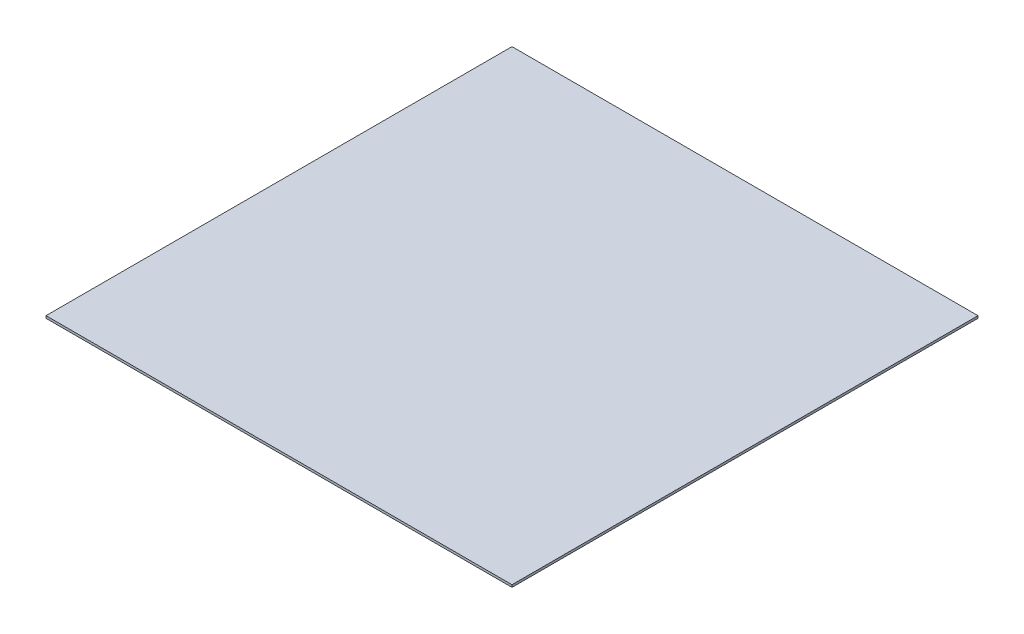
ISO-10303-21;
HEADER;
FILE_DESCRIPTION(('STEP AP214'),'2;1');
FILE_NAME('part.step','',(''),(''),'','','');
FILE_SCHEMA(('AUTOMOTIVE_DESIGN { 1 0 10303 214 1 1 1 1 }'));
ENDSEC;
DATA;
#1=APPLICATION_CONTEXT('core data for automotive mechanical design processes');
#2=APPLICATION_PROTOCOL_DEFINITION('international standard','automotive_design',2000,#1);
#3=PRODUCT_CONTEXT('',#1,'mechanical');
#4=PRODUCT('Part','Part','',(#3));
#5=PRODUCT_RELATED_PRODUCT_CATEGORY('part','',(#4));
#6=PRODUCT_DEFINITION_FORMATION('','',#4);
#7=PRODUCT_DEFINITION_CONTEXT('part definition',#1,'design');
#8=PRODUCT_DEFINITION('design','',#6,#7);
#9=PRODUCT_DEFINITION_SHAPE('','',#8);
#10=(LENGTH_UNIT() NAMED_UNIT(*) SI_UNIT(.MILLI.,.METRE.));
#11=(NAMED_UNIT(*) PLANE_ANGLE_UNIT() SI_UNIT($,.RADIAN.));
#12=(NAMED_UNIT(*) SI_UNIT($,.STERADIAN.) SOLID_ANGLE_UNIT());
#13=UNCERTAINTY_MEASURE_WITH_UNIT(LENGTH_MEASURE(1.E-05),#10,'distance_accuracy_value','');
#14=(GEOMETRIC_REPRESENTATION_CONTEXT(3) GLOBAL_UNCERTAINTY_ASSIGNED_CONTEXT((#13)) GLOBAL_UNIT_ASSIGNED_CONTEXT((#10,
#11,#12)) REPRESENTATION_CONTEXT('',''));
#15=CARTESIAN_POINT('',(0.,0.,0.));
#16=DIRECTION('',(0.,0.,1.));
#17=DIRECTION('',(1.,0.,0.));
#18=AXIS2_PLACEMENT_3D('',#15,#16,#17);
#19=CARTESIAN_POINT('',(200.,1.,200.));
#20=DIRECTION('',(-1.,0.,0.));
#21=DIRECTION('',(0.,0.,1.));
#22=AXIS2_PLACEMENT_3D('',#19,#20,#21);
#23=PLANE('',#22);
#24=DIRECTION('',(0.,0.,-1.));
#25=VECTOR('',#24,1.);
#26=CARTESIAN_POINT('',(200.,-1.,200.));
#27=LINE('',#26,#25);
#28=CARTESIAN_POINT('',(200.,-1.,200.));
#29=VERTEX_POINT('',#28);
#30=CARTESIAN_POINT('',(200.,-1.,-200.));
#31=VERTEX_POINT('',#30);
#32=EDGE_CURVE('E101',#29,#31,#27,.T.);
#33=ORIENTED_EDGE('',*,*,#32,.T.);
#34=DIRECTION('',(0.,-1.,0.));
#35=VECTOR('',#34,1.);
#36=CARTESIAN_POINT('',(200.,1.,-200.));
#37=LINE('',#36,#35);
#38=CARTESIAN_POINT('',(200.,1.,-200.));
#39=VERTEX_POINT('',#38);
#40=EDGE_CURVE('E11',#39,#31,#37,.T.);
#41=ORIENTED_EDGE('',*,*,#40,.F.);
#42=DIRECTION('',(0.,0.,-1.));
#43=VECTOR('',#42,1.);
#44=CARTESIAN_POINT('',(200.,1.,200.));
#45=LINE('',#44,#43);
#46=CARTESIAN_POINT('',(200.,1.,200.));
#47=VERTEX_POINT('',#46);
#48=EDGE_CURVE('E89',#47,#39,#45,.T.);
#49=ORIENTED_EDGE('',*,*,#48,.F.);
#50=DIRECTION('',(0.,-1.,0.));
#51=VECTOR('',#50,1.);
#52=CARTESIAN_POINT('',(200.,1.,200.));
#53=LINE('',#52,#51);
#54=EDGE_CURVE('E97',#47,#29,#53,.T.);
#55=ORIENTED_EDGE('',*,*,#54,.T.);
#56=EDGE_LOOP('',(#33,#41,#49,#55));
#57=FACE_BOUND('',#56,.T.);
#58=ADVANCED_FACE('F38',(#57),#23,.F.);
#59=CARTESIAN_POINT('',(-200.,1.,-200.));
#60=DIRECTION('',(0.,0.,1.));
#61=DIRECTION('',(1.,0.,0.));
#62=AXIS2_PLACEMENT_3D('',#59,#60,#61);
#63=PLANE('',#62);
#64=DIRECTION('',(-1.,0.,0.));
#65=VECTOR('',#64,1.);
#66=CARTESIAN_POINT('',(-200.,-1.,-200.));
#67=LINE('',#66,#65);
#68=CARTESIAN_POINT('',(-200.,-1.,-200.));
#69=VERTEX_POINT('',#68);
#70=EDGE_CURVE('E93',#31,#69,#67,.T.);
#71=ORIENTED_EDGE('',*,*,#70,.T.);
#72=DIRECTION('',(0.,-1.,0.));
#73=VECTOR('',#72,1.);
#74=CARTESIAN_POINT('',(-200.,1.,-200.));
#75=LINE('',#74,#73);
#76=CARTESIAN_POINT('',(-200.,1.,-200.));
#77=VERTEX_POINT('',#76);
#78=EDGE_CURVE('E46',#77,#69,#75,.T.);
#79=ORIENTED_EDGE('',*,*,#78,.F.);
#80=DIRECTION('',(-1.,0.,0.));
#81=VECTOR('',#80,1.);
#82=CARTESIAN_POINT('',(-200.,1.,-200.));
#83=LINE('',#82,#81);
#84=EDGE_CURVE('E84',#39,#77,#83,.T.);
#85=ORIENTED_EDGE('',*,*,#84,.F.);
#86=ORIENTED_EDGE('',*,*,#40,.T.);
#87=EDGE_LOOP('',(#71,#79,#85,#86));
#88=FACE_BOUND('',#87,.T.);
#89=ADVANCED_FACE('F92',(#88),#63,.F.);
#90=CARTESIAN_POINT('',(-200.,1.,200.));
#91=DIRECTION('',(1.,0.,0.));
#92=DIRECTION('',(0.,0.,-1.));
#93=AXIS2_PLACEMENT_3D('',#90,#91,#92);
#94=PLANE('',#93);
#95=DIRECTION('',(0.,0.,1.));
#96=VECTOR('',#95,1.);
#97=CARTESIAN_POINT('',(-200.,-1.,200.));
#98=LINE('',#97,#96);
#99=CARTESIAN_POINT('',(-200.,-1.,200.));
#100=VERTEX_POINT('',#99);
#101=EDGE_CURVE('E71',#69,#100,#98,.T.);
#102=ORIENTED_EDGE('',*,*,#101,.T.);
#103=DIRECTION('',(0.,-1.,0.));
#104=VECTOR('',#103,1.);
#105=CARTESIAN_POINT('',(-200.,1.,200.));
#106=LINE('',#105,#104);
#107=CARTESIAN_POINT('',(-200.,1.,200.));
#108=VERTEX_POINT('',#107);
#109=EDGE_CURVE('E94',#108,#100,#106,.T.);
#110=ORIENTED_EDGE('',*,*,#109,.F.);
#111=DIRECTION('',(0.,0.,1.));
#112=VECTOR('',#111,1.);
#113=CARTESIAN_POINT('',(-200.,1.,200.));
#114=LINE('',#113,#112);
#115=EDGE_CURVE('E87',#77,#108,#114,.T.);
#116=ORIENTED_EDGE('',*,*,#115,.F.);
#117=ORIENTED_EDGE('',*,*,#78,.T.);
#118=EDGE_LOOP('',(#102,#110,#116,#117));
#119=FACE_BOUND('',#118,.T.);
#120=ADVANCED_FACE('F95',(#119),#94,.F.);
#121=CARTESIAN_POINT('',(-200.,1.,200.));
#122=DIRECTION('',(0.,0.,-1.));
#123=DIRECTION('',(-1.,0.,0.));
#124=AXIS2_PLACEMENT_3D('',#121,#122,#123);
#125=PLANE('',#124);
#126=DIRECTION('',(1.,0.,0.));
#127=VECTOR('',#126,1.);
#128=CARTESIAN_POINT('',(-200.,-1.,200.));
#129=LINE('',#128,#127);
#130=EDGE_CURVE('E77',#100,#29,#129,.T.);
#131=ORIENTED_EDGE('',*,*,#130,.T.);
#132=ORIENTED_EDGE('',*,*,#54,.F.);
#133=DIRECTION('',(1.,0.,0.));
#134=VECTOR('',#133,1.);
#135=CARTESIAN_POINT('',(-200.,1.,200.));
#136=LINE('',#135,#134);
#137=EDGE_CURVE('E54',#108,#47,#136,.T.);
#138=ORIENTED_EDGE('',*,*,#137,.F.);
#139=ORIENTED_EDGE('',*,*,#109,.T.);
#140=EDGE_LOOP('',(#131,#132,#138,#139));
#141=FACE_BOUND('',#140,.T.);
#142=ADVANCED_FACE('F108',(#141),#125,.F.);
#143=CARTESIAN_POINT('',(0.,1.,0.));
#144=DIRECTION('',(0.,-1.,0.));
#145=DIRECTION('',(0.,0.,-1.));
#146=AXIS2_PLACEMENT_3D('',#143,#144,#145);
#147=PLANE('',#146);
#148=ORIENTED_EDGE('',*,*,#48,.T.);
#149=ORIENTED_EDGE('',*,*,#84,.T.);
#150=ORIENTED_EDGE('',*,*,#115,.T.);
#151=ORIENTED_EDGE('',*,*,#137,.T.);
#152=EDGE_LOOP('',(#148,#149,#150,#151));
#153=FACE_BOUND('',#152,.T.);
#154=ADVANCED_FACE('F85',(#153),#147,.F.);
#155=CARTESIAN_POINT('',(0.,-1.,0.));
#156=DIRECTION('',(0.,-1.,0.));
#157=DIRECTION('',(0.,0.,-1.));
#158=AXIS2_PLACEMENT_3D('',#155,#156,#157);
#159=PLANE('',#158);
#160=ORIENTED_EDGE('',*,*,#32,.F.);
#161=ORIENTED_EDGE('',*,*,#130,.F.);
#162=ORIENTED_EDGE('',*,*,#101,.F.);
#163=ORIENTED_EDGE('',*,*,#70,.F.);
#164=EDGE_LOOP('',(#160,#161,#162,#163));
#165=FACE_BOUND('',#164,.T.);
#166=ADVANCED_FACE('F111',(#165),#159,.T.);
#167=CLOSED_SHELL('',(#58,#89,#120,#142,#154,#166));
#168=MANIFOLD_SOLID_BREP('B2',#167);
#169=ADVANCED_BREP_SHAPE_REPRESENTATION('',(#18,#168),#14);
#170=SHAPE_DEFINITION_REPRESENTATION(#9,#169);
ENDSEC;
END-ISO-10303-21;
